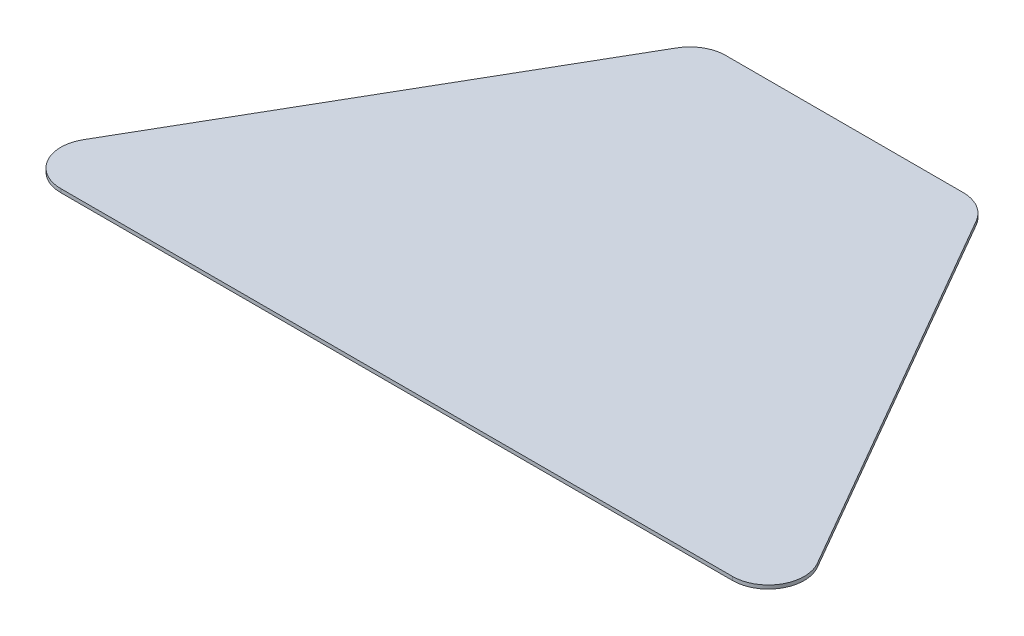
ISO-10303-21;
HEADER;
FILE_DESCRIPTION(('STEP AP214'),'2;1');
FILE_NAME('part.step','',(''),(''),'','','');
FILE_SCHEMA(('AUTOMOTIVE_DESIGN { 1 0 10303 214 1 1 1 1 }'));
ENDSEC;
DATA;
#1=APPLICATION_CONTEXT('core data for automotive mechanical design processes');
#2=APPLICATION_PROTOCOL_DEFINITION('international standard','automotive_design',2000,#1);
#3=PRODUCT_CONTEXT('',#1,'mechanical');
#4=PRODUCT('Part','Part','',(#3));
#5=PRODUCT_RELATED_PRODUCT_CATEGORY('part','',(#4));
#6=PRODUCT_DEFINITION_FORMATION('','',#4);
#7=PRODUCT_DEFINITION_CONTEXT('part definition',#1,'design');
#8=PRODUCT_DEFINITION('design','',#6,#7);
#9=PRODUCT_DEFINITION_SHAPE('','',#8);
#10=(LENGTH_UNIT() NAMED_UNIT(*) SI_UNIT(.MILLI.,.METRE.));
#11=(NAMED_UNIT(*) PLANE_ANGLE_UNIT() SI_UNIT($,.RADIAN.));
#12=(NAMED_UNIT(*) SI_UNIT($,.STERADIAN.) SOLID_ANGLE_UNIT());
#13=UNCERTAINTY_MEASURE_WITH_UNIT(LENGTH_MEASURE(1.E-05),#10,'distance_accuracy_value','');
#14=(GEOMETRIC_REPRESENTATION_CONTEXT(3) GLOBAL_UNCERTAINTY_ASSIGNED_CONTEXT((#13)) GLOBAL_UNIT_ASSIGNED_CONTEXT((#10,
#11,#12)) REPRESENTATION_CONTEXT('',''));
#15=CARTESIAN_POINT('',(0.,0.,0.));
#16=DIRECTION('',(0.,0.,1.));
#17=DIRECTION('',(1.,0.,0.));
#18=AXIS2_PLACEMENT_3D('',#15,#16,#17);
#19=CARTESIAN_POINT('',(22.2168783648704,0.1,12.5));
#20=DIRECTION('',(0.,0.,-1.));
#21=DIRECTION('',(-1.,0.,0.));
#22=AXIS2_PLACEMENT_3D('',#19,#20,#21);
#23=PLANE('',#22);
#24=DIRECTION('',(1.,0.,0.));
#25=VECTOR('',#24,1.);
#26=CARTESIAN_POINT('',(22.2168783648704,-0.1,12.5));
#27=LINE('',#26,#25);
#28=CARTESIAN_POINT('',(-18.7527767497326,-0.1,12.5));
#29=VERTEX_POINT('',#28);
#30=CARTESIAN_POINT('',(18.7527767497326,-0.1,12.5));
#31=VERTEX_POINT('',#30);
#32=EDGE_CURVE('E157',#29,#31,#27,.T.);
#33=ORIENTED_EDGE('',*,*,#32,.T.);
#34=DIRECTION('',(0.,-1.,0.));
#35=VECTOR('',#34,1.);
#36=CARTESIAN_POINT('',(18.7527767497326,0.1,12.5));
#37=LINE('',#36,#35);
#38=CARTESIAN_POINT('',(18.7527767497326,0.1,12.5));
#39=VERTEX_POINT('',#38);
#40=EDGE_CURVE('E11',#31,#39,#37,.F.);
#41=ORIENTED_EDGE('',*,*,#40,.T.);
#42=DIRECTION('',(1.,0.,0.));
#43=VECTOR('',#42,1.);
#44=CARTESIAN_POINT('',(-22.2168783648704,0.1,12.5));
#45=LINE('',#44,#43);
#46=CARTESIAN_POINT('',(-18.7527767497326,0.1,12.5));
#47=VERTEX_POINT('',#46);
#48=EDGE_CURVE('E125',#47,#39,#45,.T.);
#49=ORIENTED_EDGE('',*,*,#48,.F.);
#50=DIRECTION('',(0.,-1.,0.));
#51=VECTOR('',#50,1.);
#52=CARTESIAN_POINT('',(-18.7527767497326,0.1,12.5));
#53=LINE('',#52,#51);
#54=EDGE_CURVE('E41',#47,#29,#53,.T.);
#55=ORIENTED_EDGE('',*,*,#54,.T.);
#56=EDGE_LOOP('',(#33,#41,#49,#55));
#57=FACE_BOUND('',#56,.T.);
#58=ADVANCED_FACE('F33',(#57),#23,.F.);
#59=CARTESIAN_POINT('',(7.7831216351296,0.1,-12.5));
#60=DIRECTION('',(-0.866025403784436,0.,0.500000000000004));
#61=DIRECTION('',(0.500000000000004,0.,0.866025403784437));
#62=AXIS2_PLACEMENT_3D('',#59,#60,#61);
#63=PLANE('',#62);
#64=DIRECTION('',(-0.500000000000004,0.,-0.866025403784436));
#65=VECTOR('',#64,1.);
#66=CARTESIAN_POINT('',(7.7831216351296,-0.1,-12.5));
#67=LINE('',#66,#65);
#68=CARTESIAN_POINT('',(20.4848275573015,-0.1,9.49999999999998));
#69=VERTEX_POINT('',#68);
#70=CARTESIAN_POINT('',(8.36047190431923,-0.1,-11.5));
#71=VERTEX_POINT('',#70);
#72=EDGE_CURVE('E130',#69,#71,#67,.T.);
#73=ORIENTED_EDGE('',*,*,#72,.T.);
#74=DIRECTION('',(0.,-1.,0.));
#75=VECTOR('',#74,1.);
#76=CARTESIAN_POINT('',(8.36047190431923,0.1,-11.5));
#77=LINE('',#76,#75);
#78=CARTESIAN_POINT('',(8.36047190431923,0.1,-11.5));
#79=VERTEX_POINT('',#78);
#80=EDGE_CURVE('E48',#71,#79,#77,.F.);
#81=ORIENTED_EDGE('',*,*,#80,.T.);
#82=DIRECTION('',(-0.500000000000004,0.,-0.866025403784436));
#83=VECTOR('',#82,1.);
#84=CARTESIAN_POINT('',(7.7831216351296,0.1,-12.5));
#85=LINE('',#84,#83);
#86=CARTESIAN_POINT('',(20.4848275573015,0.1,9.49999999999998));
#87=VERTEX_POINT('',#86);
#88=EDGE_CURVE('E128',#87,#79,#85,.T.);
#89=ORIENTED_EDGE('',*,*,#88,.F.);
#90=DIRECTION('',(0.,-1.,0.));
#91=VECTOR('',#90,1.);
#92=CARTESIAN_POINT('',(20.4848275573015,0.1,9.49999999999999));
#93=LINE('',#92,#91);
#94=EDGE_CURVE('E149',#87,#69,#93,.T.);
#95=ORIENTED_EDGE('',*,*,#94,.T.);
#96=EDGE_LOOP('',(#73,#81,#89,#95));
#97=FACE_BOUND('',#96,.T.);
#98=ADVANCED_FACE('F177',(#97),#63,.F.);
#99=CARTESIAN_POINT('',(-7.7831216351296,0.1,-12.5));
#100=DIRECTION('',(0.,0.,1.));
#101=DIRECTION('',(1.,0.,0.));
#102=AXIS2_PLACEMENT_3D('',#99,#100,#101);
#103=PLANE('',#102);
#104=DIRECTION('',(-1.,0.,0.));
#105=VECTOR('',#104,1.);
#106=CARTESIAN_POINT('',(-7.7831216351296,-0.1,-12.5));
#107=LINE('',#106,#105);
#108=CARTESIAN_POINT('',(6.62842109675035,-0.1,-12.5));
#109=VERTEX_POINT('',#108);
#110=CARTESIAN_POINT('',(-6.62842109675035,-0.1,-12.5));
#111=VERTEX_POINT('',#110);
#112=EDGE_CURVE('E126',#109,#111,#107,.T.);
#113=ORIENTED_EDGE('',*,*,#112,.T.);
#114=DIRECTION('',(0.,-1.,0.));
#115=VECTOR('',#114,1.);
#116=CARTESIAN_POINT('',(-6.62842109675035,0.1,-12.5));
#117=LINE('',#116,#115);
#118=CARTESIAN_POINT('',(-6.62842109675035,0.1,-12.5));
#119=VERTEX_POINT('',#118);
#120=EDGE_CURVE('E104',#111,#119,#117,.F.);
#121=ORIENTED_EDGE('',*,*,#120,.T.);
#122=DIRECTION('',(-1.,0.,0.));
#123=VECTOR('',#122,1.);
#124=CARTESIAN_POINT('',(-7.7831216351296,0.1,-12.5));
#125=LINE('',#124,#123);
#126=CARTESIAN_POINT('',(6.62842109675035,0.1,-12.5));
#127=VERTEX_POINT('',#126);
#128=EDGE_CURVE('E165',#127,#119,#125,.T.);
#129=ORIENTED_EDGE('',*,*,#128,.F.);
#130=DIRECTION('',(0.,-1.,0.));
#131=VECTOR('',#130,1.);
#132=CARTESIAN_POINT('',(6.62842109675035,0.1,-12.5));
#133=LINE('',#132,#131);
#134=EDGE_CURVE('E109',#127,#109,#133,.T.);
#135=ORIENTED_EDGE('',*,*,#134,.T.);
#136=EDGE_LOOP('',(#113,#121,#129,#135));
#137=FACE_BOUND('',#136,.T.);
#138=ADVANCED_FACE('F176',(#137),#103,.F.);
#139=CARTESIAN_POINT('',(-7.7831216351296,0.1,-12.5));
#140=DIRECTION('',(0.866025403784436,0.,0.500000000000004));
#141=DIRECTION('',(0.500000000000004,0.,-0.866025403784436));
#142=AXIS2_PLACEMENT_3D('',#139,#140,#141);
#143=PLANE('',#142);
#144=DIRECTION('',(-0.500000000000004,0.,0.866025403784436));
#145=VECTOR('',#144,1.);
#146=CARTESIAN_POINT('',(-7.7831216351296,0.1,-12.5));
#147=LINE('',#146,#145);
#148=CARTESIAN_POINT('',(-8.36047190431923,0.1,-11.5));
#149=VERTEX_POINT('',#148);
#150=CARTESIAN_POINT('',(-20.4848275573015,0.1,9.49999999999999));
#151=VERTEX_POINT('',#150);
#152=EDGE_CURVE('E119',#149,#151,#147,.T.);
#153=ORIENTED_EDGE('',*,*,#152,.F.);
#154=DIRECTION('',(0.,-1.,0.));
#155=VECTOR('',#154,1.);
#156=CARTESIAN_POINT('',(-8.36047190431923,0.1,-11.5));
#157=LINE('',#156,#155);
#158=CARTESIAN_POINT('',(-8.36047190431923,-0.1,-11.5));
#159=VERTEX_POINT('',#158);
#160=EDGE_CURVE('E103',#149,#159,#157,.T.);
#161=ORIENTED_EDGE('',*,*,#160,.T.);
#162=DIRECTION('',(-0.500000000000004,0.,0.866025403784436));
#163=VECTOR('',#162,1.);
#164=CARTESIAN_POINT('',(-7.7831216351296,-0.1,-12.5));
#165=LINE('',#164,#163);
#166=CARTESIAN_POINT('',(-20.4848275573015,-0.1,9.49999999999999));
#167=VERTEX_POINT('',#166);
#168=EDGE_CURVE('E116',#159,#167,#165,.T.);
#169=ORIENTED_EDGE('',*,*,#168,.T.);
#170=DIRECTION('',(0.,-1.,0.));
#171=VECTOR('',#170,1.);
#172=CARTESIAN_POINT('',(-20.4848275573015,0.1,9.49999999999999));
#173=LINE('',#172,#171);
#174=EDGE_CURVE('E121',#167,#151,#173,.F.);
#175=ORIENTED_EDGE('',*,*,#174,.T.);
#176=EDGE_LOOP('',(#153,#161,#169,#175));
#177=FACE_BOUND('',#176,.T.);
#178=ADVANCED_FACE('F115',(#177),#143,.F.);
#179=CARTESIAN_POINT('',(0.,0.1,0.));
#180=DIRECTION('',(0.,-1.,0.));
#181=DIRECTION('',(0.,0.,-1.));
#182=AXIS2_PLACEMENT_3D('',#179,#180,#181);
#183=PLANE('',#182);
#184=ORIENTED_EDGE('',*,*,#128,.T.);
#185=CARTESIAN_POINT('',(-6.62842109675035,0.1,-10.5));
#186=DIRECTION('',(0.,-1.,0.));
#187=DIRECTION('',(0.,0.,-1.));
#188=AXIS2_PLACEMENT_3D('',#185,#186,#187);
#189=CIRCLE('',#188,2.);
#190=EDGE_CURVE('E147',#119,#149,#189,.F.);
#191=ORIENTED_EDGE('',*,*,#190,.T.);
#192=ORIENTED_EDGE('',*,*,#152,.T.);
#193=CARTESIAN_POINT('',(-18.7527767497326,0.1,10.5));
#194=DIRECTION('',(0.,-1.,0.));
#195=DIRECTION('',(0.,0.,-1.));
#196=AXIS2_PLACEMENT_3D('',#193,#194,#195);
#197=CIRCLE('',#196,2.);
#198=EDGE_CURVE('E142',#151,#47,#197,.F.);
#199=ORIENTED_EDGE('',*,*,#198,.T.);
#200=ORIENTED_EDGE('',*,*,#48,.T.);
#201=CARTESIAN_POINT('',(18.7527767497326,0.1,10.5));
#202=DIRECTION('',(0.,-1.,0.));
#203=DIRECTION('',(0.,0.,-1.));
#204=AXIS2_PLACEMENT_3D('',#201,#202,#203);
#205=CIRCLE('',#204,2.);
#206=EDGE_CURVE('E55',#39,#87,#205,.F.);
#207=ORIENTED_EDGE('',*,*,#206,.T.);
#208=ORIENTED_EDGE('',*,*,#88,.T.);
#209=CARTESIAN_POINT('',(6.62842109675035,0.1,-10.5));
#210=DIRECTION('',(0.,-1.,0.));
#211=DIRECTION('',(0.,0.,-1.));
#212=AXIS2_PLACEMENT_3D('',#209,#210,#211);
#213=CIRCLE('',#212,2.);
#214=EDGE_CURVE('E145',#79,#127,#213,.F.);
#215=ORIENTED_EDGE('',*,*,#214,.T.);
#216=EDGE_LOOP('',(#184,#191,#192,#199,#200,#207,#208,#215));
#217=FACE_BOUND('',#216,.T.);
#218=ADVANCED_FACE('F169',(#217),#183,.F.);
#219=CARTESIAN_POINT('',(0.,-0.1,0.));
#220=DIRECTION('',(0.,-1.,0.));
#221=DIRECTION('',(0.,0.,-1.));
#222=AXIS2_PLACEMENT_3D('',#219,#220,#221);
#223=PLANE('',#222);
#224=ORIENTED_EDGE('',*,*,#168,.F.);
#225=CARTESIAN_POINT('',(-6.62842109675035,-0.1,-10.5));
#226=DIRECTION('',(0.,-1.,0.));
#227=DIRECTION('',(0.,0.,-1.));
#228=AXIS2_PLACEMENT_3D('',#225,#226,#227);
#229=CIRCLE('',#228,2.);
#230=EDGE_CURVE('E99',#159,#111,#229,.T.);
#231=ORIENTED_EDGE('',*,*,#230,.T.);
#232=ORIENTED_EDGE('',*,*,#112,.F.);
#233=CARTESIAN_POINT('',(6.62842109675035,-0.1,-10.5));
#234=DIRECTION('',(0.,-1.,0.));
#235=DIRECTION('',(0.,0.,-1.));
#236=AXIS2_PLACEMENT_3D('',#233,#234,#235);
#237=CIRCLE('',#236,2.);
#238=EDGE_CURVE('E110',#109,#71,#237,.T.);
#239=ORIENTED_EDGE('',*,*,#238,.T.);
#240=ORIENTED_EDGE('',*,*,#72,.F.);
#241=CARTESIAN_POINT('',(18.7527767497326,-0.1,10.5));
#242=DIRECTION('',(0.,-1.,0.));
#243=DIRECTION('',(0.,0.,-1.));
#244=AXIS2_PLACEMENT_3D('',#241,#242,#243);
#245=CIRCLE('',#244,2.);
#246=EDGE_CURVE('E136',#69,#31,#245,.T.);
#247=ORIENTED_EDGE('',*,*,#246,.T.);
#248=ORIENTED_EDGE('',*,*,#32,.F.);
#249=CARTESIAN_POINT('',(-18.7527767497326,-0.1,10.5));
#250=DIRECTION('',(0.,-1.,0.));
#251=DIRECTION('',(0.,0.,-1.));
#252=AXIS2_PLACEMENT_3D('',#249,#250,#251);
#253=CIRCLE('',#252,2.);
#254=EDGE_CURVE('E120',#29,#167,#253,.T.);
#255=ORIENTED_EDGE('',*,*,#254,.T.);
#256=EDGE_LOOP('',(#224,#231,#232,#239,#240,#247,#248,#255));
#257=FACE_BOUND('',#256,.T.);
#258=ADVANCED_FACE('F123',(#257),#223,.T.);
#259=CARTESIAN_POINT('',(-6.62842109675035,0.1,-10.5));
#260=DIRECTION('',(0.,-1.,0.));
#261=DIRECTION('',(0.,0.,-1.));
#262=AXIS2_PLACEMENT_3D('',#259,#260,#261);
#263=CYLINDRICAL_SURFACE('',#262,2.);
#264=ORIENTED_EDGE('',*,*,#190,.F.);
#265=ORIENTED_EDGE('',*,*,#120,.F.);
#266=ORIENTED_EDGE('',*,*,#230,.F.);
#267=ORIENTED_EDGE('',*,*,#160,.F.);
#268=EDGE_LOOP('',(#264,#265,#266,#267));
#269=FACE_BOUND('',#268,.T.);
#270=ADVANCED_FACE('F102',(#269),#263,.T.);
#271=CARTESIAN_POINT('',(6.62842109675035,0.1,-10.5));
#272=DIRECTION('',(0.,-1.,0.));
#273=DIRECTION('',(0.,0.,-1.));
#274=AXIS2_PLACEMENT_3D('',#271,#272,#273);
#275=CYLINDRICAL_SURFACE('',#274,2.);
#276=ORIENTED_EDGE('',*,*,#214,.F.);
#277=ORIENTED_EDGE('',*,*,#80,.F.);
#278=ORIENTED_EDGE('',*,*,#238,.F.);
#279=ORIENTED_EDGE('',*,*,#134,.F.);
#280=EDGE_LOOP('',(#276,#277,#278,#279));
#281=FACE_BOUND('',#280,.T.);
#282=ADVANCED_FACE('F174',(#281),#275,.T.);
#283=CARTESIAN_POINT('',(18.7527767497326,0.1,10.5));
#284=DIRECTION('',(0.,-1.,0.));
#285=DIRECTION('',(0.,0.,-1.));
#286=AXIS2_PLACEMENT_3D('',#283,#284,#285);
#287=CYLINDRICAL_SURFACE('',#286,2.);
#288=ORIENTED_EDGE('',*,*,#206,.F.);
#289=ORIENTED_EDGE('',*,*,#40,.F.);
#290=ORIENTED_EDGE('',*,*,#246,.F.);
#291=ORIENTED_EDGE('',*,*,#94,.F.);
#292=EDGE_LOOP('',(#288,#289,#290,#291));
#293=FACE_BOUND('',#292,.T.);
#294=ADVANCED_FACE('F179',(#293),#287,.T.);
#295=CARTESIAN_POINT('',(-18.7527767497326,0.1,10.5));
#296=DIRECTION('',(0.,-1.,0.));
#297=DIRECTION('',(0.,0.,-1.));
#298=AXIS2_PLACEMENT_3D('',#295,#296,#297);
#299=CYLINDRICAL_SURFACE('',#298,2.);
#300=ORIENTED_EDGE('',*,*,#198,.F.);
#301=ORIENTED_EDGE('',*,*,#174,.F.);
#302=ORIENTED_EDGE('',*,*,#254,.F.);
#303=ORIENTED_EDGE('',*,*,#54,.F.);
#304=EDGE_LOOP('',(#300,#301,#302,#303));
#305=FACE_BOUND('',#304,.T.);
#306=ADVANCED_FACE('F35',(#305),#299,.T.);
#307=CLOSED_SHELL('',(#58,#98,#138,#178,#218,#258,#270,#282,#294,#306));
#308=MANIFOLD_SOLID_BREP('B2',#307);
#309=ADVANCED_BREP_SHAPE_REPRESENTATION('',(#18,#308),#14);
#310=SHAPE_DEFINITION_REPRESENTATION(#9,#309);
ENDSEC;
END-ISO-10303-21;
